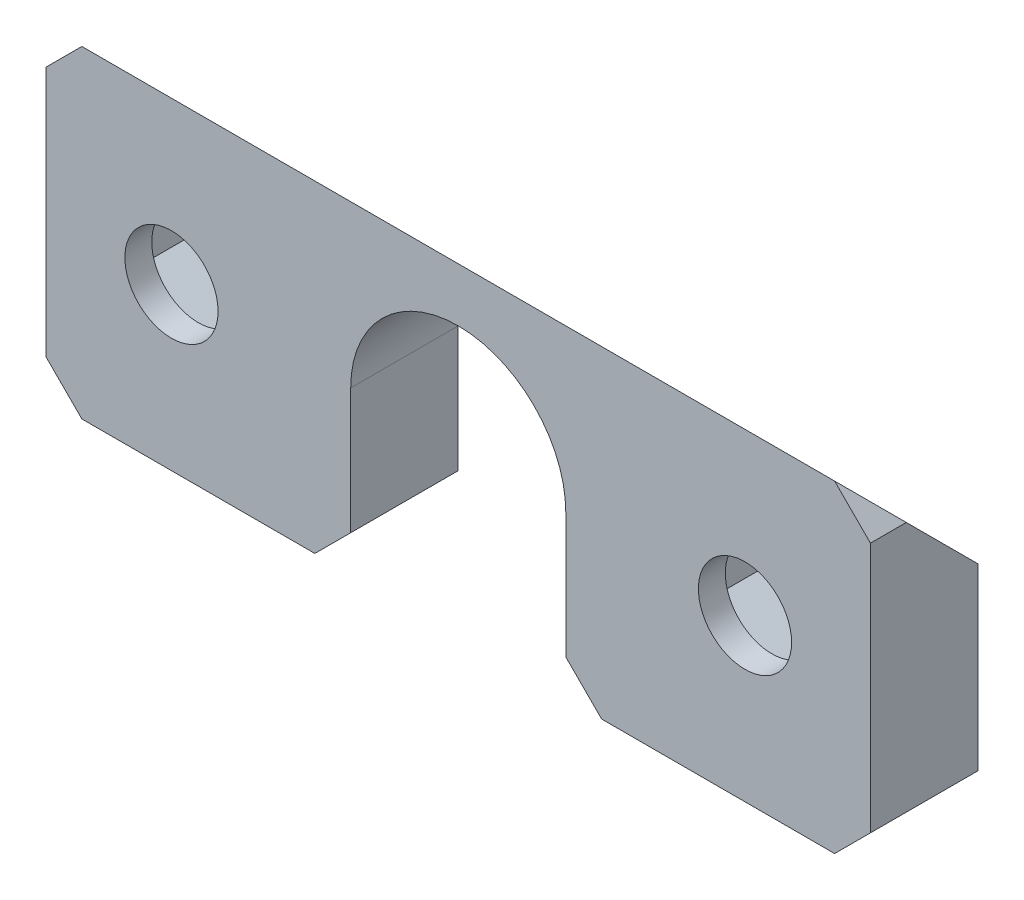
ISO-10303-21;
HEADER;
FILE_DESCRIPTION(('STEP AP214'),'2;1');
FILE_NAME('part.step','',(''),(''),'','','');
FILE_SCHEMA(('AUTOMOTIVE_DESIGN { 1 0 10303 214 1 1 1 1 }'));
ENDSEC;
DATA;
#1=APPLICATION_CONTEXT('core data for automotive mechanical design processes');
#2=APPLICATION_PROTOCOL_DEFINITION('international standard','automotive_design',2000,#1);
#3=PRODUCT_CONTEXT('',#1,'mechanical');
#4=PRODUCT('Part','Part','',(#3));
#5=PRODUCT_RELATED_PRODUCT_CATEGORY('part','',(#4));
#6=PRODUCT_DEFINITION_FORMATION('','',#4);
#7=PRODUCT_DEFINITION_CONTEXT('part definition',#1,'design');
#8=PRODUCT_DEFINITION('design','',#6,#7);
#9=PRODUCT_DEFINITION_SHAPE('','',#8);
#10=(LENGTH_UNIT() NAMED_UNIT(*) SI_UNIT(.MILLI.,.METRE.));
#11=(NAMED_UNIT(*) PLANE_ANGLE_UNIT() SI_UNIT($,.RADIAN.));
#12=(NAMED_UNIT(*) SI_UNIT($,.STERADIAN.) SOLID_ANGLE_UNIT());
#13=UNCERTAINTY_MEASURE_WITH_UNIT(LENGTH_MEASURE(1.E-05),#10,'distance_accuracy_value','');
#14=(GEOMETRIC_REPRESENTATION_CONTEXT(3) GLOBAL_UNCERTAINTY_ASSIGNED_CONTEXT((#13)) GLOBAL_UNIT_ASSIGNED_CONTEXT((#10,
#11,#12)) REPRESENTATION_CONTEXT('',''));
#15=CARTESIAN_POINT('',(0.,0.,0.));
#16=DIRECTION('',(0.,0.,1.));
#17=DIRECTION('',(1.,0.,0.));
#18=AXIS2_PLACEMENT_3D('',#15,#16,#17);
#19=CARTESIAN_POINT('',(-31.2108436137032,-520.298939869288,783.620141884642));
#20=DIRECTION('',(0.,0.,-1.));
#21=DIRECTION('',(-1.,0.,0.));
#22=AXIS2_PLACEMENT_3D('',#19,#20,#21);
#23=PLANE('',#22);
#24=DIRECTION('',(0.,1.,0.));
#25=VECTOR('',#24,1.);
#26=CARTESIAN_POINT('',(-54.2108436137042,-513.298939869288,783.620141884642));
#27=LINE('',#26,#25);
#28=CARTESIAN_POINT('',(-54.2108436137042,-527.298939869288,783.620141884642));
#29=VERTEX_POINT('',#28);
#30=CARTESIAN_POINT('',(-54.2108436137042,-517.298939869288,783.620141884642));
#31=VERTEX_POINT('',#30);
#32=EDGE_CURVE('E317',#29,#31,#27,.T.);
#33=ORIENTED_EDGE('',*,*,#32,.T.);
#34=DIRECTION('',(1.,0.,0.));
#35=VECTOR('',#34,1.);
#36=CARTESIAN_POINT('',(-10.2108436137042,-517.298939869288,783.620141884642));
#37=LINE('',#36,#35);
#38=CARTESIAN_POINT('',(-50.5146911909982,-517.298939869288,783.620141884642));
#39=VERTEX_POINT('',#38);
#40=EDGE_CURVE('E401',#31,#39,#37,.T.);
#41=ORIENTED_EDGE('',*,*,#40,.T.);
#42=DIRECTION('',(0.866025403784443,0.499999999999993,0.));
#43=VECTOR('',#42,1.);
#44=CARTESIAN_POINT('',(-51.4608436137042,-517.845201225232,783.620141884642));
#45=LINE('',#44,#43);
#46=CARTESIAN_POINT('',(-51.4608436137042,-517.845201225232,783.620141884642));
#47=VERTEX_POINT('',#46);
#48=EDGE_CURVE('E495',#47,#39,#45,.T.);
#49=ORIENTED_EDGE('',*,*,#48,.F.);
#50=DIRECTION('',(0.,1.,0.));
#51=VECTOR('',#50,1.);
#52=CARTESIAN_POINT('',(-51.4608436137042,-522.752678513344,783.620141884642));
#53=LINE('',#52,#51);
#54=CARTESIAN_POINT('',(-51.4608436137042,-522.752678513344,783.620141884642));
#55=VERTEX_POINT('',#54);
#56=EDGE_CURVE('E256',#55,#47,#53,.T.);
#57=ORIENTED_EDGE('',*,*,#56,.F.);
#58=DIRECTION('',(-0.866025403784444,0.49999999999999,0.));
#59=VECTOR('',#58,1.);
#60=CARTESIAN_POINT('',(-47.2108436137042,-525.2064171574,783.620141884642));
#61=LINE('',#60,#59);
#62=CARTESIAN_POINT('',(-47.2108436137042,-525.2064171574,783.620141884642));
#63=VERTEX_POINT('',#62);
#64=EDGE_CURVE('E261',#63,#55,#61,.T.);
#65=ORIENTED_EDGE('',*,*,#64,.F.);
#66=DIRECTION('',(-0.866025403784444,-0.499999999999991,0.));
#67=VECTOR('',#66,1.);
#68=CARTESIAN_POINT('',(-42.9608436137042,-522.752678513344,783.620141884642));
#69=LINE('',#68,#67);
#70=CARTESIAN_POINT('',(-42.9608436137042,-522.752678513344,783.620141884642));
#71=VERTEX_POINT('',#70);
#72=EDGE_CURVE('E507',#71,#63,#69,.T.);
#73=ORIENTED_EDGE('',*,*,#72,.F.);
#74=DIRECTION('',(0.,-1.,0.));
#75=VECTOR('',#74,1.);
#76=CARTESIAN_POINT('',(-42.9608436137042,-517.845201225232,783.620141884642));
#77=LINE('',#76,#75);
#78=CARTESIAN_POINT('',(-42.9608436137042,-517.845201225232,783.620141884642));
#79=VERTEX_POINT('',#78);
#80=EDGE_CURVE('E505',#79,#71,#77,.T.);
#81=ORIENTED_EDGE('',*,*,#80,.F.);
#82=DIRECTION('',(0.866025403784436,-0.500000000000005,0.));
#83=VECTOR('',#82,1.);
#84=CARTESIAN_POINT('',(-47.2108436137042,-515.391462581176,783.620141884642));
#85=LINE('',#84,#83);
#86=CARTESIAN_POINT('',(-43.9069960364103,-517.298939869288,783.620141884642));
#87=VERTEX_POINT('',#86);
#88=EDGE_CURVE('E498',#87,#79,#85,.T.);
#89=ORIENTED_EDGE('',*,*,#88,.F.);
#90=DIRECTION('',(1.,0.,0.));
#91=VECTOR('',#90,1.);
#92=CARTESIAN_POINT('',(-10.2108436137042,-517.298939869288,783.620141884642));
#93=LINE('',#92,#91);
#94=CARTESIAN_POINT('',(-36.4069960364099,-517.298939869288,783.620141884642));
#95=VERTEX_POINT('',#94);
#96=EDGE_CURVE('E399',#87,#95,#93,.T.);
#97=ORIENTED_EDGE('',*,*,#96,.T.);
#98=CARTESIAN_POINT('',(-31.2108436137032,-520.298939869288,783.620141884642));
#99=DIRECTION('',(0.,0.,1.));
#100=DIRECTION('',(-1.,0.,0.));
#101=AXIS2_PLACEMENT_3D('',#98,#99,#100);
#102=CIRCLE('',#101,6.);
#103=CARTESIAN_POINT('',(-37.2108436137032,-520.298939869288,783.620141884642));
#104=VERTEX_POINT('',#103);
#105=EDGE_CURVE('E310',#95,#104,#102,.T.);
#106=ORIENTED_EDGE('',*,*,#105,.T.);
#107=DIRECTION('',(0.,-1.,0.));
#108=VECTOR('',#107,1.);
#109=CARTESIAN_POINT('',(-37.2108436137032,-520.298939869288,783.620141884642));
#110=LINE('',#109,#108);
#111=CARTESIAN_POINT('',(-37.2108436137032,-527.298939869288,783.620141884642));
#112=VERTEX_POINT('',#111);
#113=EDGE_CURVE('E309',#104,#112,#110,.T.);
#114=ORIENTED_EDGE('',*,*,#113,.T.);
#115=DIRECTION('',(0.707106781186541,0.707106781186554,0.));
#116=VECTOR('',#115,1.);
#117=CARTESIAN_POINT('',(-30.7108436137034,-520.798939869288,783.620141884642));
#118=LINE('',#117,#116);
#119=CARTESIAN_POINT('',(-39.2108436137032,-529.298939869288,783.620141884642));
#120=VERTEX_POINT('',#119);
#121=EDGE_CURVE('E386',#112,#120,#118,.F.);
#122=ORIENTED_EDGE('',*,*,#121,.T.);
#123=DIRECTION('',(-1.,0.,0.));
#124=VECTOR('',#123,1.);
#125=CARTESIAN_POINT('',(-37.2108436137032,-529.298939869288,783.620141884642));
#126=LINE('',#125,#124);
#127=CARTESIAN_POINT('',(-52.2108436137042,-529.298939869288,783.620141884642));
#128=VERTEX_POINT('',#127);
#129=EDGE_CURVE('E313',#120,#128,#126,.T.);
#130=ORIENTED_EDGE('',*,*,#129,.T.);
#131=DIRECTION('',(-0.707106781186547,0.707106781186547,0.));
#132=VECTOR('',#131,1.);
#133=CARTESIAN_POINT('',(-52.2108436137042,-529.298939869288,783.620141884642));
#134=LINE('',#133,#132);
#135=EDGE_CURVE('E315',#128,#29,#134,.T.);
#136=ORIENTED_EDGE('',*,*,#135,.T.);
#137=EDGE_LOOP('',(#33,#41,#49,#57,#65,#73,#81,#89,#97,#106,#114,#122,#130,#136));
#138=FACE_BOUND('',#137,.T.);
#139=ADVANCED_FACE('F38',(#138),#23,.T.);
#140=CARTESIAN_POINT('',(-15.2108436137042,-515.391462581176,783.620141884642));
#141=DIRECTION('',(-0.500000000000013,-0.866025403784431,0.));
#142=DIRECTION('',(0.866025403784431,-0.500000000000013,0.));
#143=AXIS2_PLACEMENT_3D('',#140,#141,#142);
#144=PLANE('',#143);
#145=DIRECTION('',(0.,0.,1.));
#146=VECTOR('',#145,1.);
#147=CARTESIAN_POINT('',(-15.2108436137042,-515.391462581176,783.620141884642));
#148=LINE('',#147,#146);
#149=CARTESIAN_POINT('',(-15.2108436137042,-515.391462581176,785.527619172755));
#150=VERTEX_POINT('',#149);
#151=CARTESIAN_POINT('',(-15.2108436137042,-515.391462581176,788.120141884643));
#152=VERTEX_POINT('',#151);
#153=EDGE_CURVE('E288',#150,#152,#148,.T.);
#154=ORIENTED_EDGE('',*,*,#153,.F.);
#155=DIRECTION('',(0.774596669241475,-0.447213595499969,-0.447213595499961));
#156=VECTOR('',#155,1.);
#157=CARTESIAN_POINT('',(-14.5500740982454,-515.772958038799,785.146123715132));
#158=LINE('',#157,#156);
#159=CARTESIAN_POINT('',(-11.9069960364104,-517.298939869288,783.620141884642));
#160=VERTEX_POINT('',#159);
#161=EDGE_CURVE('E412',#150,#160,#158,.T.);
#162=ORIENTED_EDGE('',*,*,#161,.T.);
#163=DIRECTION('',(0.866025403784431,-0.500000000000013,0.));
#164=VECTOR('',#163,1.);
#165=CARTESIAN_POINT('',(-15.2108436137042,-515.391462581176,783.620141884642));
#166=LINE('',#165,#164);
#167=CARTESIAN_POINT('',(-10.9608436137042,-517.845201225232,783.620141884642));
#168=VERTEX_POINT('',#167);
#169=EDGE_CURVE('E274',#160,#168,#166,.T.);
#170=ORIENTED_EDGE('',*,*,#169,.T.);
#171=DIRECTION('',(0.,0.,1.));
#172=VECTOR('',#171,1.);
#173=CARTESIAN_POINT('',(-10.9608436137042,-517.845201225232,783.620141884642));
#174=LINE('',#173,#172);
#175=CARTESIAN_POINT('',(-10.9608436137042,-517.845201225232,788.120141884643));
#176=VERTEX_POINT('',#175);
#177=EDGE_CURVE('E302',#168,#176,#174,.T.);
#178=ORIENTED_EDGE('',*,*,#177,.T.);
#179=DIRECTION('',(-0.866025403784431,0.500000000000013,0.));
#180=VECTOR('',#179,1.);
#181=CARTESIAN_POINT('',(-15.2108436137042,-515.391462581176,788.120141884643));
#182=LINE('',#181,#180);
#183=EDGE_CURVE('E491',#176,#152,#182,.T.);
#184=ORIENTED_EDGE('',*,*,#183,.T.);
#185=EDGE_LOOP('',(#154,#162,#170,#178,#184));
#186=FACE_BOUND('',#185,.T.);
#187=ADVANCED_FACE('F454',(#186),#144,.T.);
#188=CARTESIAN_POINT('',(-10.9608436137042,-517.845201225232,783.620141884642));
#189=DIRECTION('',(-1.,0.,0.));
#190=DIRECTION('',(0.,0.,1.));
#191=AXIS2_PLACEMENT_3D('',#188,#189,#190);
#192=PLANE('',#191);
#193=DIRECTION('',(0.,0.,1.));
#194=VECTOR('',#193,1.);
#195=CARTESIAN_POINT('',(-10.9608436137042,-522.752678513344,783.620141884642));
#196=LINE('',#195,#194);
#197=CARTESIAN_POINT('',(-10.9608436137042,-522.752678513344,783.620141884642));
#198=VERTEX_POINT('',#197);
#199=CARTESIAN_POINT('',(-10.9608436137042,-522.752678513344,788.120141884643));
#200=VERTEX_POINT('',#199);
#201=EDGE_CURVE('E299',#198,#200,#196,.T.);
#202=ORIENTED_EDGE('',*,*,#201,.T.);
#203=DIRECTION('',(0.,1.,0.));
#204=VECTOR('',#203,1.);
#205=CARTESIAN_POINT('',(-10.9608436137042,-517.845201225232,788.120141884643));
#206=LINE('',#205,#204);
#207=EDGE_CURVE('E496',#200,#176,#206,.T.);
#208=ORIENTED_EDGE('',*,*,#207,.T.);
#209=ORIENTED_EDGE('',*,*,#177,.F.);
#210=DIRECTION('',(0.,-1.,0.));
#211=VECTOR('',#210,1.);
#212=CARTESIAN_POINT('',(-10.9608436137042,-517.845201225232,783.620141884642));
#213=LINE('',#212,#211);
#214=EDGE_CURVE('E276',#168,#198,#213,.T.);
#215=ORIENTED_EDGE('',*,*,#214,.T.);
#216=EDGE_LOOP('',(#202,#208,#209,#215));
#217=FACE_BOUND('',#216,.T.);
#218=ADVANCED_FACE('F460',(#217),#192,.T.);
#219=CARTESIAN_POINT('',(-10.9608436137042,-522.752678513344,783.620141884642));
#220=DIRECTION('',(-0.500000000000002,0.866025403784438,0.));
#221=DIRECTION('',(-0.866025403784438,-0.500000000000002,0.));
#222=AXIS2_PLACEMENT_3D('',#219,#220,#221);
#223=PLANE('',#222);
#224=DIRECTION('',(0.,0.,1.));
#225=VECTOR('',#224,1.);
#226=CARTESIAN_POINT('',(-15.2108436137043,-525.2064171574,783.620141884642));
#227=LINE('',#226,#225);
#228=CARTESIAN_POINT('',(-15.2108436137043,-525.2064171574,783.620141884642));
#229=VERTEX_POINT('',#228);
#230=CARTESIAN_POINT('',(-15.2108436137043,-525.2064171574,788.120141884643));
#231=VERTEX_POINT('',#230);
#232=EDGE_CURVE('E296',#229,#231,#227,.T.);
#233=ORIENTED_EDGE('',*,*,#232,.T.);
#234=DIRECTION('',(0.866025403784438,0.500000000000002,0.));
#235=VECTOR('',#234,1.);
#236=CARTESIAN_POINT('',(-10.9608436137042,-522.752678513344,788.120141884643));
#237=LINE('',#236,#235);
#238=EDGE_CURVE('E500',#231,#200,#237,.T.);
#239=ORIENTED_EDGE('',*,*,#238,.T.);
#240=ORIENTED_EDGE('',*,*,#201,.F.);
#241=DIRECTION('',(-0.866025403784438,-0.500000000000002,0.));
#242=VECTOR('',#241,1.);
#243=CARTESIAN_POINT('',(-10.9608436137042,-522.752678513344,783.620141884642));
#244=LINE('',#243,#242);
#245=EDGE_CURVE('E278',#198,#229,#244,.T.);
#246=ORIENTED_EDGE('',*,*,#245,.T.);
#247=EDGE_LOOP('',(#233,#239,#240,#246));
#248=FACE_BOUND('',#247,.T.);
#249=ADVANCED_FACE('F788',(#248),#223,.T.);
#250=CARTESIAN_POINT('',(-15.2108436137043,-525.2064171574,783.620141884642));
#251=DIRECTION('',(0.500000000000013,0.866025403784431,0.));
#252=DIRECTION('',(-0.866025403784431,0.500000000000013,0.));
#253=AXIS2_PLACEMENT_3D('',#250,#251,#252);
#254=PLANE('',#253);
#255=DIRECTION('',(0.,0.,1.));
#256=VECTOR('',#255,1.);
#257=CARTESIAN_POINT('',(-19.4608436137042,-522.752678513344,783.620141884642));
#258=LINE('',#257,#256);
#259=CARTESIAN_POINT('',(-19.4608436137042,-522.752678513344,783.620141884642));
#260=VERTEX_POINT('',#259);
#261=CARTESIAN_POINT('',(-19.4608436137042,-522.752678513344,788.120141884643));
#262=VERTEX_POINT('',#261);
#263=EDGE_CURVE('E293',#260,#262,#258,.T.);
#264=ORIENTED_EDGE('',*,*,#263,.T.);
#265=DIRECTION('',(0.866025403784431,-0.500000000000013,0.));
#266=VECTOR('',#265,1.);
#267=CARTESIAN_POINT('',(-15.2108436137043,-525.2064171574,788.120141884643));
#268=LINE('',#267,#266);
#269=EDGE_CURVE('E820',#262,#231,#268,.T.);
#270=ORIENTED_EDGE('',*,*,#269,.T.);
#271=ORIENTED_EDGE('',*,*,#232,.F.);
#272=DIRECTION('',(-0.866025403784431,0.500000000000013,0.));
#273=VECTOR('',#272,1.);
#274=CARTESIAN_POINT('',(-15.2108436137043,-525.2064171574,783.620141884642));
#275=LINE('',#274,#273);
#276=EDGE_CURVE('E280',#229,#260,#275,.T.);
#277=ORIENTED_EDGE('',*,*,#276,.T.);
#278=EDGE_LOOP('',(#264,#270,#271,#277));
#279=FACE_BOUND('',#278,.T.);
#280=ADVANCED_FACE('F778',(#279),#254,.T.);
#281=CARTESIAN_POINT('',(-19.4608436137042,-522.752678513344,783.620141884642));
#282=DIRECTION('',(1.,0.,0.));
#283=DIRECTION('',(0.,1.,0.));
#284=AXIS2_PLACEMENT_3D('',#281,#282,#283);
#285=PLANE('',#284);
#286=DIRECTION('',(0.,0.,1.));
#287=VECTOR('',#286,1.);
#288=CARTESIAN_POINT('',(-19.4608436137042,-517.845201225232,783.620141884642));
#289=LINE('',#288,#287);
#290=CARTESIAN_POINT('',(-19.4608436137042,-517.845201225232,783.620141884642));
#291=VERTEX_POINT('',#290);
#292=CARTESIAN_POINT('',(-19.4608436137042,-517.845201225232,788.120141884643));
#293=VERTEX_POINT('',#292);
#294=EDGE_CURVE('E290',#291,#293,#289,.T.);
#295=ORIENTED_EDGE('',*,*,#294,.T.);
#296=DIRECTION('',(0.,-1.,0.));
#297=VECTOR('',#296,1.);
#298=CARTESIAN_POINT('',(-19.4608436137042,-522.752678513344,788.120141884643));
#299=LINE('',#298,#297);
#300=EDGE_CURVE('E819',#293,#262,#299,.T.);
#301=ORIENTED_EDGE('',*,*,#300,.T.);
#302=ORIENTED_EDGE('',*,*,#263,.F.);
#303=DIRECTION('',(0.,1.,0.));
#304=VECTOR('',#303,1.);
#305=CARTESIAN_POINT('',(-19.4608436137042,-522.752678513344,783.620141884642));
#306=LINE('',#305,#304);
#307=EDGE_CURVE('E282',#260,#291,#306,.T.);
#308=ORIENTED_EDGE('',*,*,#307,.T.);
#309=EDGE_LOOP('',(#295,#301,#302,#308));
#310=FACE_BOUND('',#309,.T.);
#311=ADVANCED_FACE('F637',(#310),#285,.T.);
#312=CARTESIAN_POINT('',(-19.4608436137042,-517.845201225232,783.620141884642));
#313=DIRECTION('',(0.500000000000002,-0.866025403784438,0.));
#314=DIRECTION('',(0.866025403784438,0.500000000000002,0.));
#315=AXIS2_PLACEMENT_3D('',#312,#313,#314);
#316=PLANE('',#315);
#317=DIRECTION('',(0.866025403784438,0.500000000000002,0.));
#318=VECTOR('',#317,1.);
#319=CARTESIAN_POINT('',(-19.4608436137042,-517.845201225232,783.620141884642));
#320=LINE('',#319,#318);
#321=CARTESIAN_POINT('',(-18.5146911909981,-517.298939869288,783.620141884642));
#322=VERTEX_POINT('',#321);
#323=EDGE_CURVE('E285',#291,#322,#320,.T.);
#324=ORIENTED_EDGE('',*,*,#323,.T.);
#325=DIRECTION('',(0.774596669241485,0.447213595499961,0.447213595499953));
#326=VECTOR('',#325,1.);
#327=CARTESIAN_POINT('',(-19.271613129163,-517.735948954043,783.183132799887));
#328=LINE('',#327,#326);
#329=EDGE_CURVE('E410',#322,#150,#328,.T.);
#330=ORIENTED_EDGE('',*,*,#329,.T.);
#331=ORIENTED_EDGE('',*,*,#153,.T.);
#332=DIRECTION('',(-0.866025403784438,-0.500000000000002,0.));
#333=VECTOR('',#332,1.);
#334=CARTESIAN_POINT('',(-19.4608436137042,-517.845201225232,788.120141884643));
#335=LINE('',#334,#333);
#336=EDGE_CURVE('E251',#152,#293,#335,.T.);
#337=ORIENTED_EDGE('',*,*,#336,.T.);
#338=ORIENTED_EDGE('',*,*,#294,.F.);
#339=EDGE_LOOP('',(#324,#330,#331,#337,#338));
#340=FACE_BOUND('',#339,.T.);
#341=ADVANCED_FACE('F486',(#340),#316,.T.);
#342=CARTESIAN_POINT('',(-51.4608436137042,-517.845201225232,783.620141884642));
#343=DIRECTION('',(0.499999999999993,-0.866025403784443,0.));
#344=DIRECTION('',(0.866025403784443,0.499999999999993,0.));
#345=AXIS2_PLACEMENT_3D('',#342,#343,#344);
#346=PLANE('',#345);
#347=ORIENTED_EDGE('',*,*,#48,.T.);
#348=DIRECTION('',(0.774596669241492,0.447213595499954,0.447213595499946));
#349=VECTOR('',#348,1.);
#350=CARTESIAN_POINT('',(-51.271613129163,-517.735948954043,783.183132799888));
#351=LINE('',#350,#349);
#352=CARTESIAN_POINT('',(-47.2108436137042,-515.391462581176,785.527619172755));
#353=VERTEX_POINT('',#352);
#354=EDGE_CURVE('E404',#39,#353,#351,.T.);
#355=ORIENTED_EDGE('',*,*,#354,.T.);
#356=DIRECTION('',(0.,0.,1.));
#357=VECTOR('',#356,1.);
#358=CARTESIAN_POINT('',(-47.2108436137042,-515.391462581176,783.620141884642));
#359=LINE('',#358,#357);
#360=CARTESIAN_POINT('',(-47.2108436137042,-515.391462581176,788.120141884643));
#361=VERTEX_POINT('',#360);
#362=EDGE_CURVE('E250',#353,#361,#359,.T.);
#363=ORIENTED_EDGE('',*,*,#362,.T.);
#364=DIRECTION('',(-0.866025403784443,-0.499999999999993,0.));
#365=VECTOR('',#364,1.);
#366=CARTESIAN_POINT('',(-51.4608436137042,-517.845201225232,788.120141884643));
#367=LINE('',#366,#365);
#368=CARTESIAN_POINT('',(-51.4608436137042,-517.845201225232,788.120141884643));
#369=VERTEX_POINT('',#368);
#370=EDGE_CURVE('E233',#361,#369,#367,.T.);
#371=ORIENTED_EDGE('',*,*,#370,.T.);
#372=DIRECTION('',(0.,0.,1.));
#373=VECTOR('',#372,1.);
#374=CARTESIAN_POINT('',(-51.4608436137042,-517.845201225232,783.620141884642));
#375=LINE('',#374,#373);
#376=EDGE_CURVE('E247',#47,#369,#375,.T.);
#377=ORIENTED_EDGE('',*,*,#376,.F.);
#378=EDGE_LOOP('',(#347,#355,#363,#371,#377));
#379=FACE_BOUND('',#378,.T.);
#380=ADVANCED_FACE('F246',(#379),#346,.T.);
#381=CARTESIAN_POINT('',(-47.2108436137042,-515.391462581176,783.620141884642));
#382=DIRECTION('',(-0.500000000000005,-0.866025403784435,0.));
#383=DIRECTION('',(0.866025403784436,-0.500000000000005,0.));
#384=AXIS2_PLACEMENT_3D('',#381,#382,#383);
#385=PLANE('',#384);
#386=ORIENTED_EDGE('',*,*,#362,.F.);
#387=DIRECTION('',(0.774596669241482,-0.447213595499963,-0.447213595499955));
#388=VECTOR('',#387,1.);
#389=CARTESIAN_POINT('',(-46.5500740982454,-515.772958038799,785.146123715132));
#390=LINE('',#389,#388);
#391=EDGE_CURVE('E406',#353,#87,#390,.T.);
#392=ORIENTED_EDGE('',*,*,#391,.T.);
#393=ORIENTED_EDGE('',*,*,#88,.T.);
#394=DIRECTION('',(0.,0.,1.));
#395=VECTOR('',#394,1.);
#396=CARTESIAN_POINT('',(-42.9608436137042,-517.845201225232,783.620141884642));
#397=LINE('',#396,#395);
#398=CARTESIAN_POINT('',(-42.9608436137042,-517.845201225232,788.120141884643));
#399=VERTEX_POINT('',#398);
#400=EDGE_CURVE('E270',#79,#399,#397,.T.);
#401=ORIENTED_EDGE('',*,*,#400,.T.);
#402=DIRECTION('',(-0.866025403784436,0.500000000000005,0.));
#403=VECTOR('',#402,1.);
#404=CARTESIAN_POINT('',(-47.2108436137042,-515.391462581176,788.120141884643));
#405=LINE('',#404,#403);
#406=EDGE_CURVE('E252',#399,#361,#405,.T.);
#407=ORIENTED_EDGE('',*,*,#406,.T.);
#408=EDGE_LOOP('',(#386,#392,#393,#401,#407));
#409=FACE_BOUND('',#408,.T.);
#410=ADVANCED_FACE('F515',(#409),#385,.T.);
#411=CARTESIAN_POINT('',(-42.9608436137042,-517.845201225232,783.620141884642));
#412=DIRECTION('',(-1.,0.,0.));
#413=DIRECTION('',(0.,0.,1.));
#414=AXIS2_PLACEMENT_3D('',#411,#412,#413);
#415=PLANE('',#414);
#416=DIRECTION('',(0.,0.,1.));
#417=VECTOR('',#416,1.);
#418=CARTESIAN_POINT('',(-42.9608436137042,-522.752678513344,783.620141884642));
#419=LINE('',#418,#417);
#420=CARTESIAN_POINT('',(-42.9608436137042,-522.752678513344,788.120141884643));
#421=VERTEX_POINT('',#420);
#422=EDGE_CURVE('E267',#71,#421,#419,.T.);
#423=ORIENTED_EDGE('',*,*,#422,.T.);
#424=DIRECTION('',(0.,1.,0.));
#425=VECTOR('',#424,1.);
#426=CARTESIAN_POINT('',(-42.9608436137042,-517.845201225232,788.120141884643));
#427=LINE('',#426,#425);
#428=EDGE_CURVE('E826',#421,#399,#427,.T.);
#429=ORIENTED_EDGE('',*,*,#428,.T.);
#430=ORIENTED_EDGE('',*,*,#400,.F.);
#431=ORIENTED_EDGE('',*,*,#80,.T.);
#432=EDGE_LOOP('',(#423,#429,#430,#431));
#433=FACE_BOUND('',#432,.T.);
#434=ADVANCED_FACE('F618',(#433),#415,.T.);
#435=CARTESIAN_POINT('',(-42.9608436137042,-522.752678513344,783.620141884642));
#436=DIRECTION('',(-0.499999999999991,0.866025403784444,0.));
#437=DIRECTION('',(-0.866025403784444,-0.499999999999991,0.));
#438=AXIS2_PLACEMENT_3D('',#435,#436,#437);
#439=PLANE('',#438);
#440=DIRECTION('',(0.,0.,1.));
#441=VECTOR('',#440,1.);
#442=CARTESIAN_POINT('',(-47.2108436137042,-525.2064171574,783.620141884642));
#443=LINE('',#442,#441);
#444=CARTESIAN_POINT('',(-47.2108436137042,-525.2064171574,788.120141884643));
#445=VERTEX_POINT('',#444);
#446=EDGE_CURVE('E259',#63,#445,#443,.T.);
#447=ORIENTED_EDGE('',*,*,#446,.T.);
#448=DIRECTION('',(0.866025403784444,0.499999999999991,0.));
#449=VECTOR('',#448,1.);
#450=CARTESIAN_POINT('',(-42.9608436137042,-522.752678513344,788.120141884643));
#451=LINE('',#450,#449);
#452=EDGE_CURVE('E829',#445,#421,#451,.T.);
#453=ORIENTED_EDGE('',*,*,#452,.T.);
#454=ORIENTED_EDGE('',*,*,#422,.F.);
#455=ORIENTED_EDGE('',*,*,#72,.T.);
#456=EDGE_LOOP('',(#447,#453,#454,#455));
#457=FACE_BOUND('',#456,.T.);
#458=ADVANCED_FACE('F755',(#457),#439,.T.);
#459=CARTESIAN_POINT('',(-47.2108436137042,-525.2064171574,783.620141884642));
#460=DIRECTION('',(0.49999999999999,0.866025403784444,0.));
#461=DIRECTION('',(-0.866025403784444,0.49999999999999,0.));
#462=AXIS2_PLACEMENT_3D('',#459,#460,#461);
#463=PLANE('',#462);
#464=DIRECTION('',(0.,0.,1.));
#465=VECTOR('',#464,1.);
#466=CARTESIAN_POINT('',(-51.4608436137042,-522.752678513344,783.620141884642));
#467=LINE('',#466,#465);
#468=CARTESIAN_POINT('',(-51.4608436137042,-522.752678513344,788.120141884643));
#469=VERTEX_POINT('',#468);
#470=EDGE_CURVE('E257',#55,#469,#467,.T.);
#471=ORIENTED_EDGE('',*,*,#470,.T.);
#472=DIRECTION('',(0.866025403784444,-0.49999999999999,0.));
#473=VECTOR('',#472,1.);
#474=CARTESIAN_POINT('',(-47.2108436137042,-525.2064171574,788.120141884643));
#475=LINE('',#474,#473);
#476=EDGE_CURVE('E236',#469,#445,#475,.T.);
#477=ORIENTED_EDGE('',*,*,#476,.T.);
#478=ORIENTED_EDGE('',*,*,#446,.F.);
#479=ORIENTED_EDGE('',*,*,#64,.T.);
#480=EDGE_LOOP('',(#471,#477,#478,#479));
#481=FACE_BOUND('',#480,.T.);
#482=ADVANCED_FACE('F471',(#481),#463,.T.);
#483=CARTESIAN_POINT('',(-51.4608436137042,-522.752678513344,783.620141884642));
#484=DIRECTION('',(1.,0.,0.));
#485=DIRECTION('',(0.,0.,-1.));
#486=AXIS2_PLACEMENT_3D('',#483,#484,#485);
#487=PLANE('',#486);
#488=ORIENTED_EDGE('',*,*,#376,.T.);
#489=DIRECTION('',(0.,-1.,0.));
#490=VECTOR('',#489,1.);
#491=CARTESIAN_POINT('',(-51.4608436137042,-522.752678513344,788.120141884643));
#492=LINE('',#491,#490);
#493=EDGE_CURVE('E229',#369,#469,#492,.T.);
#494=ORIENTED_EDGE('',*,*,#493,.T.);
#495=ORIENTED_EDGE('',*,*,#470,.F.);
#496=ORIENTED_EDGE('',*,*,#56,.T.);
#497=EDGE_LOOP('',(#488,#494,#495,#496));
#498=FACE_BOUND('',#497,.T.);
#499=ADVANCED_FACE('F254',(#498),#487,.T.);
#500=CARTESIAN_POINT('',(-25.2108436137032,-520.298939869288,783.620141884642));
#501=VERTEX_POINT('',#500);
#502=CARTESIAN_POINT('',(-26.0146911909966,-517.298939869288,783.620141884642));
#503=VERTEX_POINT('',#502);
#504=EDGE_CURVE('E306',#501,#503,#102,.T.);
#505=ORIENTED_EDGE('',*,*,#504,.T.);
#506=DIRECTION('',(1.,0.,0.));
#507=VECTOR('',#506,1.);
#508=CARTESIAN_POINT('',(-10.2108436137042,-517.298939869288,783.620141884642));
#509=LINE('',#508,#507);
#510=EDGE_CURVE('E397',#503,#322,#509,.T.);
#511=ORIENTED_EDGE('',*,*,#510,.T.);
#512=ORIENTED_EDGE('',*,*,#323,.F.);
#513=ORIENTED_EDGE('',*,*,#307,.F.);
#514=ORIENTED_EDGE('',*,*,#276,.F.);
#515=ORIENTED_EDGE('',*,*,#245,.F.);
#516=ORIENTED_EDGE('',*,*,#214,.F.);
#517=ORIENTED_EDGE('',*,*,#169,.F.);
#518=DIRECTION('',(1.,0.,0.));
#519=VECTOR('',#518,1.);
#520=CARTESIAN_POINT('',(-10.2108436137042,-517.298939869288,783.620141884642));
#521=LINE('',#520,#519);
#522=CARTESIAN_POINT('',(-8.21084361370418,-517.298939869288,783.620141884642));
#523=VERTEX_POINT('',#522);
#524=EDGE_CURVE('E395',#160,#523,#521,.T.);
#525=ORIENTED_EDGE('',*,*,#524,.T.);
#526=DIRECTION('',(0.,-1.,0.));
#527=VECTOR('',#526,1.);
#528=CARTESIAN_POINT('',(-8.21084361370418,-513.298939869288,783.620141884642));
#529=LINE('',#528,#527);
#530=CARTESIAN_POINT('',(-8.21084361370418,-527.298939869288,783.620141884642));
#531=VERTEX_POINT('',#530);
#532=EDGE_CURVE('E320',#523,#531,#529,.T.);
#533=ORIENTED_EDGE('',*,*,#532,.T.);
#534=DIRECTION('',(-0.707106781186547,-0.707106781186548,0.));
#535=VECTOR('',#534,1.);
#536=CARTESIAN_POINT('',(-8.21084361370418,-527.298939869288,783.620141884642));
#537=LINE('',#536,#535);
#538=CARTESIAN_POINT('',(-10.2108436137042,-529.298939869288,783.620141884642));
#539=VERTEX_POINT('',#538);
#540=EDGE_CURVE('E322',#531,#539,#537,.T.);
#541=ORIENTED_EDGE('',*,*,#540,.T.);
#542=DIRECTION('',(-1.,0.,0.));
#543=VECTOR('',#542,1.);
#544=CARTESIAN_POINT('',(-10.2108436137042,-529.298939869288,783.620141884642));
#545=LINE('',#544,#543);
#546=CARTESIAN_POINT('',(-23.2108436137032,-529.298939869288,783.620141884642));
#547=VERTEX_POINT('',#546);
#548=EDGE_CURVE('E324',#539,#547,#545,.T.);
#549=ORIENTED_EDGE('',*,*,#548,.T.);
#550=DIRECTION('',(0.707106781186554,-0.707106781186541,0.));
#551=VECTOR('',#550,1.);
#552=CARTESIAN_POINT('',(-31.7108436137032,-520.798939869288,783.620141884642));
#553=LINE('',#552,#551);
#554=CARTESIAN_POINT('',(-25.2108436137032,-527.298939869288,783.620141884642));
#555=VERTEX_POINT('',#554);
#556=EDGE_CURVE('E388',#547,#555,#553,.F.);
#557=ORIENTED_EDGE('',*,*,#556,.T.);
#558=DIRECTION('',(0.,1.,0.));
#559=VECTOR('',#558,1.);
#560=CARTESIAN_POINT('',(-25.2108436137032,-520.298939869288,783.620141884642));
#561=LINE('',#560,#559);
#562=EDGE_CURVE('E327',#555,#501,#561,.T.);
#563=ORIENTED_EDGE('',*,*,#562,.T.);
#564=EDGE_LOOP('',(#505,#511,#512,#513,#514,#515,#516,#517,#525,#533,#541,#549,#557,#563));
#565=FACE_BOUND('',#564,.T.);
#566=ADVANCED_FACE('F456',(#565),#23,.T.);
#567=CARTESIAN_POINT('',(-31.2108436137032,-520.298939869288,789.620141884643));
#568=DIRECTION('',(0.,0.,-1.));
#569=DIRECTION('',(-1.,0.,0.));
#570=AXIS2_PLACEMENT_3D('',#567,#568,#569);
#571=PLANE('',#570);
#572=DIRECTION('',(0.,1.,0.));
#573=VECTOR('',#572,1.);
#574=CARTESIAN_POINT('',(-25.2108436137032,-520.298939869288,789.620141884643));
#575=LINE('',#574,#573);
#576=CARTESIAN_POINT('',(-25.2108436137032,-527.298939869288,789.620141884643));
#577=VERTEX_POINT('',#576);
#578=CARTESIAN_POINT('',(-25.2108436137032,-520.298939869288,789.620141884643));
#579=VERTEX_POINT('',#578);
#580=EDGE_CURVE('E360',#577,#579,#575,.T.);
#581=ORIENTED_EDGE('',*,*,#580,.F.);
#582=DIRECTION('',(-0.707106781186554,0.707106781186541,0.));
#583=VECTOR('',#582,1.);
#584=CARTESIAN_POINT('',(-25.2108436137032,-527.298939869288,789.620141884643));
#585=LINE('',#584,#583);
#586=CARTESIAN_POINT('',(-23.2108436137032,-529.298939869288,789.620141884643));
#587=VERTEX_POINT('',#586);
#588=EDGE_CURVE('E382',#577,#587,#585,.F.);
#589=ORIENTED_EDGE('',*,*,#588,.T.);
#590=DIRECTION('',(-1.,0.,0.));
#591=VECTOR('',#590,1.);
#592=CARTESIAN_POINT('',(-10.2108436137042,-529.298939869288,789.620141884643));
#593=LINE('',#592,#591);
#594=CARTESIAN_POINT('',(-10.2108436137042,-529.298939869288,789.620141884643));
#595=VERTEX_POINT('',#594);
#596=EDGE_CURVE('E357',#595,#587,#593,.T.);
#597=ORIENTED_EDGE('',*,*,#596,.F.);
#598=DIRECTION('',(-0.707106781186547,-0.707106781186548,0.));
#599=VECTOR('',#598,1.);
#600=CARTESIAN_POINT('',(-8.21084361370418,-527.298939869288,789.620141884643));
#601=LINE('',#600,#599);
#602=CARTESIAN_POINT('',(-8.21084361370418,-527.298939869288,789.620141884643));
#603=VERTEX_POINT('',#602);
#604=EDGE_CURVE('E354',#603,#595,#601,.T.);
#605=ORIENTED_EDGE('',*,*,#604,.F.);
#606=DIRECTION('',(0.,-1.,0.));
#607=VECTOR('',#606,1.);
#608=CARTESIAN_POINT('',(-8.21084361370418,-513.298939869288,789.620141884643));
#609=LINE('',#608,#607);
#610=CARTESIAN_POINT('',(-8.21084361370418,-513.298939869288,789.620141884643));
#611=VERTEX_POINT('',#610);
#612=EDGE_CURVE('E351',#611,#603,#609,.T.);
#613=ORIENTED_EDGE('',*,*,#612,.F.);
#614=DIRECTION('',(0.707106781186547,-0.707106781186548,0.));
#615=VECTOR('',#614,1.);
#616=CARTESIAN_POINT('',(-8.21084361370418,-513.298939869288,789.620141884643));
#617=LINE('',#616,#615);
#618=CARTESIAN_POINT('',(-10.2108436137042,-511.298939869288,789.620141884643));
#619=VERTEX_POINT('',#618);
#620=EDGE_CURVE('E348',#619,#611,#617,.T.);
#621=ORIENTED_EDGE('',*,*,#620,.F.);
#622=DIRECTION('',(1.,0.,0.));
#623=VECTOR('',#622,1.);
#624=CARTESIAN_POINT('',(-10.2108436137042,-511.298939869288,789.620141884643));
#625=LINE('',#624,#623);
#626=CARTESIAN_POINT('',(-52.2108436137042,-511.298939869288,789.620141884643));
#627=VERTEX_POINT('',#626);
#628=EDGE_CURVE('E345',#627,#619,#625,.T.);
#629=ORIENTED_EDGE('',*,*,#628,.F.);
#630=DIRECTION('',(0.707106781186547,0.707106781186547,0.));
#631=VECTOR('',#630,1.);
#632=CARTESIAN_POINT('',(-52.2108436137042,-511.298939869288,789.620141884643));
#633=LINE('',#632,#631);
#634=CARTESIAN_POINT('',(-54.2108436137042,-513.298939869288,789.620141884643));
#635=VERTEX_POINT('',#634);
#636=EDGE_CURVE('E343',#635,#627,#633,.T.);
#637=ORIENTED_EDGE('',*,*,#636,.F.);
#638=DIRECTION('',(0.,1.,0.));
#639=VECTOR('',#638,1.);
#640=CARTESIAN_POINT('',(-54.2108436137042,-513.298939869288,789.620141884643));
#641=LINE('',#640,#639);
#642=CARTESIAN_POINT('',(-54.2108436137042,-527.298939869288,789.620141884643));
#643=VERTEX_POINT('',#642);
#644=EDGE_CURVE('E340',#643,#635,#641,.T.);
#645=ORIENTED_EDGE('',*,*,#644,.F.);
#646=DIRECTION('',(-0.707106781186547,0.707106781186547,0.));
#647=VECTOR('',#646,1.);
#648=CARTESIAN_POINT('',(-52.2108436137042,-529.298939869288,789.620141884643));
#649=LINE('',#648,#647);
#650=CARTESIAN_POINT('',(-52.2108436137042,-529.298939869288,789.620141884643));
#651=VERTEX_POINT('',#650);
#652=EDGE_CURVE('E337',#651,#643,#649,.T.);
#653=ORIENTED_EDGE('',*,*,#652,.F.);
#654=DIRECTION('',(-1.,0.,0.));
#655=VECTOR('',#654,1.);
#656=CARTESIAN_POINT('',(-37.2108436137032,-529.298939869288,789.620141884643));
#657=LINE('',#656,#655);
#658=CARTESIAN_POINT('',(-39.2108436137032,-529.298939869288,789.620141884643));
#659=VERTEX_POINT('',#658);
#660=EDGE_CURVE('E335',#659,#651,#657,.T.);
#661=ORIENTED_EDGE('',*,*,#660,.F.);
#662=DIRECTION('',(-0.707106781186541,-0.707106781186554,0.));
#663=VECTOR('',#662,1.);
#664=CARTESIAN_POINT('',(-39.2108436137032,-529.298939869288,789.620141884643));
#665=LINE('',#664,#663);
#666=CARTESIAN_POINT('',(-37.2108436137032,-527.298939869288,789.620141884643));
#667=VERTEX_POINT('',#666);
#668=EDGE_CURVE('E380',#659,#667,#665,.F.);
#669=ORIENTED_EDGE('',*,*,#668,.T.);
#670=DIRECTION('',(0.,-1.,0.));
#671=VECTOR('',#670,1.);
#672=CARTESIAN_POINT('',(-37.2108436137032,-520.298939869288,789.620141884643));
#673=LINE('',#672,#671);
#674=CARTESIAN_POINT('',(-37.2108436137032,-520.298939869288,789.620141884643));
#675=VERTEX_POINT('',#674);
#676=EDGE_CURVE('E332',#675,#667,#673,.T.);
#677=ORIENTED_EDGE('',*,*,#676,.F.);
#678=CARTESIAN_POINT('',(-31.2108436137032,-520.298939869288,789.620141884643));
#679=DIRECTION('',(0.,0.,1.));
#680=DIRECTION('',(-1.,0.,0.));
#681=AXIS2_PLACEMENT_3D('',#678,#679,#680);
#682=CIRCLE('',#681,6.);
#683=EDGE_CURVE('E305',#579,#675,#682,.T.);
#684=ORIENTED_EDGE('',*,*,#683,.F.);
#685=EDGE_LOOP('',(#581,#589,#597,#605,#613,#621,#629,#637,#645,#653,#661,#669,#677,#684));
#686=FACE_BOUND('',#685,.T.);
#687=CARTESIAN_POINT('',(-47.2108436137041,-520.298939869288,789.620141884643));
#688=DIRECTION('',(0.,0.,1.));
#689=DIRECTION('',(1.,0.,0.));
#690=AXIS2_PLACEMENT_3D('',#687,#688,#689);
#691=CIRCLE('',#690,2.60000000000001);
#692=CARTESIAN_POINT('',(-44.6108436137041,-520.298939869288,789.620141884643));
#693=VERTEX_POINT('',#692);
#694=EDGE_CURVE('E834',#693,#693,#691,.T.);
#695=ORIENTED_EDGE('',*,*,#694,.F.);
#696=EDGE_LOOP('',(#695));
#697=FACE_BOUND('',#696,.T.);
#698=CARTESIAN_POINT('',(-15.2108436137042,-520.298939869288,789.620141884643));
#699=DIRECTION('',(0.,0.,1.));
#700=DIRECTION('',(1.,0.,0.));
#701=AXIS2_PLACEMENT_3D('',#698,#699,#700);
#702=CIRCLE('',#701,2.60000000000001);
#703=CARTESIAN_POINT('',(-12.6108436137042,-520.298939869288,789.620141884643));
#704=VERTEX_POINT('',#703);
#705=EDGE_CURVE('E838',#704,#704,#702,.T.);
#706=ORIENTED_EDGE('',*,*,#705,.F.);
#707=EDGE_LOOP('',(#706));
#708=FACE_BOUND('',#707,.T.);
#709=ADVANCED_FACE('F425',(#686,#697,#708),#571,.F.);
#710=CARTESIAN_POINT('',(-31.2108436137032,-520.298939869288,783.620141884642));
#711=DIRECTION('',(0.,0.,1.));
#712=DIRECTION('',(1.,0.,0.));
#713=AXIS2_PLACEMENT_3D('',#710,#711,#712);
#714=CYLINDRICAL_SURFACE('',#713,6.);
#715=ORIENTED_EDGE('',*,*,#105,.F.);
#716=CARTESIAN_POINT('',(-31.2108436137032,-520.298939869288,780.620141884643));
#717=DIRECTION('',(0.,0.707106781186541,-0.707106781186554));
#718=DIRECTION('',(0.,0.707106781186554,0.707106781186541));
#719=AXIS2_PLACEMENT_3D('',#716,#717,#718);
#720=ELLIPSE('',#719,8.48528137423849,6.);
#721=EDGE_CURVE('E408',#95,#503,#720,.T.);
#722=ORIENTED_EDGE('',*,*,#721,.T.);
#723=ORIENTED_EDGE('',*,*,#504,.F.);
#724=DIRECTION('',(0.,0.,1.));
#725=VECTOR('',#724,1.);
#726=CARTESIAN_POINT('',(-25.2108436137032,-520.298939869288,783.620141884642));
#727=LINE('',#726,#725);
#728=EDGE_CURVE('E329',#501,#579,#727,.T.);
#729=ORIENTED_EDGE('',*,*,#728,.T.);
#730=ORIENTED_EDGE('',*,*,#683,.T.);
#731=DIRECTION('',(0.,0.,1.));
#732=VECTOR('',#731,1.);
#733=CARTESIAN_POINT('',(-37.2108436137032,-520.298939869288,783.620141884642));
#734=LINE('',#733,#732);
#735=EDGE_CURVE('E241',#104,#675,#734,.T.);
#736=ORIENTED_EDGE('',*,*,#735,.F.);
#737=EDGE_LOOP('',(#715,#722,#723,#729,#730,#736));
#738=FACE_BOUND('',#737,.T.);
#739=ADVANCED_FACE('F470',(#738),#714,.F.);
#740=CARTESIAN_POINT('',(-37.2108436137032,-520.298939869288,783.620141884642));
#741=DIRECTION('',(-1.,0.,0.));
#742=DIRECTION('',(0.,-1.,0.));
#743=AXIS2_PLACEMENT_3D('',#740,#741,#742);
#744=PLANE('',#743);
#745=ORIENTED_EDGE('',*,*,#676,.T.);
#746=DIRECTION('',(0.,0.,-1.));
#747=VECTOR('',#746,1.);
#748=CARTESIAN_POINT('',(-37.2108436137032,-527.298939869288,783.620141884642));
#749=LINE('',#748,#747);
#750=EDGE_CURVE('E393',#667,#112,#749,.T.);
#751=ORIENTED_EDGE('',*,*,#750,.T.);
#752=ORIENTED_EDGE('',*,*,#113,.F.);
#753=ORIENTED_EDGE('',*,*,#735,.T.);
#754=EDGE_LOOP('',(#745,#751,#752,#753));
#755=FACE_BOUND('',#754,.T.);
#756=ADVANCED_FACE('F524',(#755),#744,.F.);
#757=CARTESIAN_POINT('',(-37.2108436137032,-529.298939869288,783.620141884642));
#758=DIRECTION('',(0.,1.,0.));
#759=DIRECTION('',(0.,0.,1.));
#760=AXIS2_PLACEMENT_3D('',#757,#758,#759);
#761=PLANE('',#760);
#762=ORIENTED_EDGE('',*,*,#129,.F.);
#763=DIRECTION('',(0.,0.,1.));
#764=VECTOR('',#763,1.);
#765=CARTESIAN_POINT('',(-39.2108436137032,-529.298939869288,783.620141884642));
#766=LINE('',#765,#764);
#767=EDGE_CURVE('E390',#120,#659,#766,.T.);
#768=ORIENTED_EDGE('',*,*,#767,.T.);
#769=ORIENTED_EDGE('',*,*,#660,.T.);
#770=DIRECTION('',(0.,0.,1.));
#771=VECTOR('',#770,1.);
#772=CARTESIAN_POINT('',(-52.2108436137042,-529.298939869288,783.620141884642));
#773=LINE('',#772,#771);
#774=EDGE_CURVE('E374',#128,#651,#773,.T.);
#775=ORIENTED_EDGE('',*,*,#774,.F.);
#776=EDGE_LOOP('',(#762,#768,#769,#775));
#777=FACE_BOUND('',#776,.T.);
#778=ADVANCED_FACE('F532',(#777),#761,.F.);
#779=CARTESIAN_POINT('',(-52.2108436137042,-529.298939869288,783.620141884642));
#780=DIRECTION('',(0.707106781186548,0.707106781186548,0.));
#781=DIRECTION('',(-0.707106781186548,0.707106781186548,0.));
#782=AXIS2_PLACEMENT_3D('',#779,#780,#781);
#783=PLANE('',#782);
#784=ORIENTED_EDGE('',*,*,#652,.T.);
#785=DIRECTION('',(0.,0.,1.));
#786=VECTOR('',#785,1.);
#787=CARTESIAN_POINT('',(-54.2108436137042,-527.298939869288,783.620141884642));
#788=LINE('',#787,#786);
#789=EDGE_CURVE('E372',#29,#643,#788,.T.);
#790=ORIENTED_EDGE('',*,*,#789,.F.);
#791=ORIENTED_EDGE('',*,*,#135,.F.);
#792=ORIENTED_EDGE('',*,*,#774,.T.);
#793=EDGE_LOOP('',(#784,#790,#791,#792));
#794=FACE_BOUND('',#793,.T.);
#795=ADVANCED_FACE('F440',(#794),#783,.F.);
#796=CARTESIAN_POINT('',(-54.2108436137042,-513.298939869288,783.620141884642));
#797=DIRECTION('',(1.,0.,0.));
#798=DIRECTION('',(0.,1.,0.));
#799=AXIS2_PLACEMENT_3D('',#796,#797,#798);
#800=PLANE('',#799);
#801=DIRECTION('',(0.,0.,1.));
#802=VECTOR('',#801,1.);
#803=CARTESIAN_POINT('',(-54.2108436137042,-513.298939869288,783.620141884642));
#804=LINE('',#803,#802);
#805=CARTESIAN_POINT('',(-54.2108436137042,-513.298939869288,787.620141884643));
#806=VERTEX_POINT('',#805);
#807=EDGE_CURVE('E370',#806,#635,#804,.T.);
#808=ORIENTED_EDGE('',*,*,#807,.F.);
#809=DIRECTION('',(0.,-0.707106781186554,-0.707106781186541));
#810=VECTOR('',#809,1.);
#811=CARTESIAN_POINT('',(-54.2108436137042,-517.298939869288,783.620141884642));
#812=LINE('',#811,#810);
#813=EDGE_CURVE('E11',#806,#31,#812,.T.);
#814=ORIENTED_EDGE('',*,*,#813,.T.);
#815=ORIENTED_EDGE('',*,*,#32,.F.);
#816=ORIENTED_EDGE('',*,*,#789,.T.);
#817=ORIENTED_EDGE('',*,*,#644,.T.);
#818=EDGE_LOOP('',(#808,#814,#815,#816,#817));
#819=FACE_BOUND('',#818,.T.);
#820=ADVANCED_FACE('F433',(#819),#800,.F.);
#821=CARTESIAN_POINT('',(-52.2108436137042,-511.298939869288,783.620141884642));
#822=DIRECTION('',(0.707106781186548,-0.707106781186548,0.));
#823=DIRECTION('',(0.707106781186548,0.707106781186548,0.));
#824=AXIS2_PLACEMENT_3D('',#821,#822,#823);
#825=PLANE('',#824);
#826=ORIENTED_EDGE('',*,*,#636,.T.);
#827=DIRECTION('',(-0.577350269189629,-0.577350269189629,-0.577350269189619));
#828=VECTOR('',#827,1.);
#829=CARTESIAN_POINT('',(-49.2108436137038,-508.298939869288,792.620141884643));
#830=LINE('',#829,#828);
#831=EDGE_CURVE('E47',#627,#806,#830,.T.);
#832=ORIENTED_EDGE('',*,*,#831,.T.);
#833=ORIENTED_EDGE('',*,*,#807,.T.);
#834=EDGE_LOOP('',(#826,#832,#833));
#835=FACE_BOUND('',#834,.T.);
#836=ADVANCED_FACE('F443',(#835),#825,.F.);
#837=CARTESIAN_POINT('',(-8.21084361370418,-513.298939869288,783.620141884642));
#838=DIRECTION('',(-0.707106781186548,-0.707106781186547,0.));
#839=DIRECTION('',(0.707106781186547,-0.707106781186548,0.));
#840=AXIS2_PLACEMENT_3D('',#837,#838,#839);
#841=PLANE('',#840);
#842=DIRECTION('',(0.,0.,1.));
#843=VECTOR('',#842,1.);
#844=CARTESIAN_POINT('',(-8.21084361370418,-513.298939869288,783.620141884642));
#845=LINE('',#844,#843);
#846=CARTESIAN_POINT('',(-8.21084361370418,-513.298939869288,787.620141884643));
#847=VERTEX_POINT('',#846);
#848=EDGE_CURVE('E368',#847,#611,#845,.T.);
#849=ORIENTED_EDGE('',*,*,#848,.F.);
#850=DIRECTION('',(-0.577350269189629,0.57735026918963,0.577350269189619));
#851=VECTOR('',#850,1.);
#852=CARTESIAN_POINT('',(-13.2108436137039,-508.298939869289,792.620141884642));
#853=LINE('',#852,#851);
#854=EDGE_CURVE('E415',#847,#619,#853,.T.);
#855=ORIENTED_EDGE('',*,*,#854,.T.);
#856=ORIENTED_EDGE('',*,*,#620,.T.);
#857=EDGE_LOOP('',(#849,#855,#856));
#858=FACE_BOUND('',#857,.T.);
#859=ADVANCED_FACE('F419',(#858),#841,.F.);
#860=CARTESIAN_POINT('',(-8.21084361370418,-513.298939869288,783.620141884642));
#861=DIRECTION('',(-1.,0.,0.));
#862=DIRECTION('',(0.,-1.,0.));
#863=AXIS2_PLACEMENT_3D('',#860,#861,#862);
#864=PLANE('',#863);
#865=ORIENTED_EDGE('',*,*,#532,.F.);
#866=DIRECTION('',(0.,0.707106781186554,0.707106781186541));
#867=VECTOR('',#866,1.);
#868=CARTESIAN_POINT('',(-8.21084361370418,-517.298939869288,783.620141884642));
#869=LINE('',#868,#867);
#870=EDGE_CURVE('E61',#523,#847,#869,.T.);
#871=ORIENTED_EDGE('',*,*,#870,.T.);
#872=ORIENTED_EDGE('',*,*,#848,.T.);
#873=ORIENTED_EDGE('',*,*,#612,.T.);
#874=DIRECTION('',(0.,0.,1.));
#875=VECTOR('',#874,1.);
#876=CARTESIAN_POINT('',(-8.21084361370418,-527.298939869288,783.620141884642));
#877=LINE('',#876,#875);
#878=EDGE_CURVE('E366',#531,#603,#877,.T.);
#879=ORIENTED_EDGE('',*,*,#878,.F.);
#880=EDGE_LOOP('',(#865,#871,#872,#873,#879));
#881=FACE_BOUND('',#880,.T.);
#882=ADVANCED_FACE('F450',(#881),#864,.F.);
#883=CARTESIAN_POINT('',(-8.21084361370418,-527.298939869288,783.620141884642));
#884=DIRECTION('',(-0.707106781186548,0.707106781186547,0.));
#885=DIRECTION('',(-0.707106781186547,-0.707106781186548,0.));
#886=AXIS2_PLACEMENT_3D('',#883,#884,#885);
#887=PLANE('',#886);
#888=ORIENTED_EDGE('',*,*,#604,.T.);
#889=DIRECTION('',(0.,0.,1.));
#890=VECTOR('',#889,1.);
#891=CARTESIAN_POINT('',(-10.2108436137042,-529.298939869288,783.620141884642));
#892=LINE('',#891,#890);
#893=EDGE_CURVE('E364',#539,#595,#892,.T.);
#894=ORIENTED_EDGE('',*,*,#893,.F.);
#895=ORIENTED_EDGE('',*,*,#540,.F.);
#896=ORIENTED_EDGE('',*,*,#878,.T.);
#897=EDGE_LOOP('',(#888,#894,#895,#896));
#898=FACE_BOUND('',#897,.T.);
#899=ADVANCED_FACE('F570',(#898),#887,.F.);
#900=CARTESIAN_POINT('',(-10.2108436137042,-529.298939869288,783.620141884642));
#901=DIRECTION('',(0.,1.,0.));
#902=DIRECTION('',(0.,0.,1.));
#903=AXIS2_PLACEMENT_3D('',#900,#901,#902);
#904=PLANE('',#903);
#905=ORIENTED_EDGE('',*,*,#596,.T.);
#906=DIRECTION('',(0.,0.,-1.));
#907=VECTOR('',#906,1.);
#908=CARTESIAN_POINT('',(-23.2108436137032,-529.298939869288,783.620141884642));
#909=LINE('',#908,#907);
#910=EDGE_CURVE('E384',#587,#547,#909,.T.);
#911=ORIENTED_EDGE('',*,*,#910,.T.);
#912=ORIENTED_EDGE('',*,*,#548,.F.);
#913=ORIENTED_EDGE('',*,*,#893,.T.);
#914=EDGE_LOOP('',(#905,#911,#912,#913));
#915=FACE_BOUND('',#914,.T.);
#916=ADVANCED_FACE('F673',(#915),#904,.F.);
#917=CARTESIAN_POINT('',(-25.2108436137032,-520.298939869288,783.620141884642));
#918=DIRECTION('',(1.,0.,0.));
#919=DIRECTION('',(0.,0.,-1.));
#920=AXIS2_PLACEMENT_3D('',#917,#918,#919);
#921=PLANE('',#920);
#922=ORIENTED_EDGE('',*,*,#562,.F.);
#923=DIRECTION('',(0.,0.,1.));
#924=VECTOR('',#923,1.);
#925=CARTESIAN_POINT('',(-25.2108436137032,-527.298939869288,783.620141884642));
#926=LINE('',#925,#924);
#927=EDGE_CURVE('E240',#555,#577,#926,.T.);
#928=ORIENTED_EDGE('',*,*,#927,.T.);
#929=ORIENTED_EDGE('',*,*,#580,.T.);
#930=ORIENTED_EDGE('',*,*,#728,.F.);
#931=EDGE_LOOP('',(#922,#928,#929,#930));
#932=FACE_BOUND('',#931,.T.);
#933=ADVANCED_FACE('F668',(#932),#921,.F.);
#934=CARTESIAN_POINT('',(0.,0.,788.120141884643));
#935=DIRECTION('',(0.,0.,1.));
#936=DIRECTION('',(1.,0.,0.));
#937=AXIS2_PLACEMENT_3D('',#934,#935,#936);
#938=PLANE('',#937);
#939=ORIENTED_EDGE('',*,*,#370,.F.);
#940=ORIENTED_EDGE('',*,*,#406,.F.);
#941=ORIENTED_EDGE('',*,*,#428,.F.);
#942=ORIENTED_EDGE('',*,*,#452,.F.);
#943=ORIENTED_EDGE('',*,*,#476,.F.);
#944=ORIENTED_EDGE('',*,*,#493,.F.);
#945=EDGE_LOOP('',(#939,#940,#941,#942,#943,#944));
#946=FACE_BOUND('',#945,.T.);
#947=CARTESIAN_POINT('',(-47.2108436137041,-520.298939869288,788.120141884643));
#948=DIRECTION('',(0.,0.,1.));
#949=DIRECTION('',(1.,0.,0.));
#950=AXIS2_PLACEMENT_3D('',#947,#948,#949);
#951=CIRCLE('',#950,2.60000000000001);
#952=CARTESIAN_POINT('',(-44.6108436137041,-520.298939869288,788.120141884643));
#953=VERTEX_POINT('',#952);
#954=EDGE_CURVE('E833',#953,#953,#951,.T.);
#955=ORIENTED_EDGE('',*,*,#954,.T.);
#956=EDGE_LOOP('',(#955));
#957=FACE_BOUND('',#956,.T.);
#958=ADVANCED_FACE('F231',(#946,#957),#938,.F.);
#959=CARTESIAN_POINT('',(-47.2108436137041,-520.298939869288,788.120141884643));
#960=DIRECTION('',(0.,0.,1.));
#961=DIRECTION('',(1.,0.,0.));
#962=AXIS2_PLACEMENT_3D('',#959,#960,#961);
#963=CYLINDRICAL_SURFACE('',#962,2.60000000000001);
#964=ORIENTED_EDGE('',*,*,#954,.F.);
#965=EDGE_LOOP('',(#964));
#966=FACE_BOUND('',#965,.T.);
#967=ORIENTED_EDGE('',*,*,#694,.T.);
#968=EDGE_LOOP('',(#967));
#969=FACE_BOUND('',#968,.T.);
#970=ADVANCED_FACE('F711',(#966,#969),#963,.F.);
#971=ORIENTED_EDGE('',*,*,#183,.F.);
#972=ORIENTED_EDGE('',*,*,#207,.F.);
#973=ORIENTED_EDGE('',*,*,#238,.F.);
#974=ORIENTED_EDGE('',*,*,#269,.F.);
#975=ORIENTED_EDGE('',*,*,#300,.F.);
#976=ORIENTED_EDGE('',*,*,#336,.F.);
#977=EDGE_LOOP('',(#971,#972,#973,#974,#975,#976));
#978=FACE_BOUND('',#977,.T.);
#979=CARTESIAN_POINT('',(-15.2108436137042,-520.298939869288,788.120141884643));
#980=DIRECTION('',(0.,0.,1.));
#981=DIRECTION('',(1.,0.,0.));
#982=AXIS2_PLACEMENT_3D('',#979,#980,#981);
#983=CIRCLE('',#982,2.60000000000001);
#984=CARTESIAN_POINT('',(-12.6108436137042,-520.298939869288,788.120141884643));
#985=VERTEX_POINT('',#984);
#986=EDGE_CURVE('E837',#985,#985,#983,.T.);
#987=ORIENTED_EDGE('',*,*,#986,.T.);
#988=EDGE_LOOP('',(#987));
#989=FACE_BOUND('',#988,.T.);
#990=ADVANCED_FACE('F701',(#978,#989),#938,.F.);
#991=CARTESIAN_POINT('',(-15.2108436137042,-520.298939869288,788.120141884643));
#992=DIRECTION('',(0.,0.,1.));
#993=DIRECTION('',(1.,0.,0.));
#994=AXIS2_PLACEMENT_3D('',#991,#992,#993);
#995=CYLINDRICAL_SURFACE('',#994,2.60000000000001);
#996=ORIENTED_EDGE('',*,*,#986,.F.);
#997=EDGE_LOOP('',(#996));
#998=FACE_BOUND('',#997,.T.);
#999=ORIENTED_EDGE('',*,*,#705,.T.);
#1000=EDGE_LOOP('',(#999));
#1001=FACE_BOUND('',#1000,.T.);
#1002=ADVANCED_FACE('F550',(#998,#1001),#995,.F.);
#1003=CARTESIAN_POINT('',(-25.2108436137032,-527.298939869288,783.620141884642));
#1004=DIRECTION('',(0.707106781186541,0.707106781186554,0.));
#1005=DIRECTION('',(0.,0.,1.));
#1006=AXIS2_PLACEMENT_3D('',#1003,#1004,#1005);
#1007=PLANE('',#1006);
#1008=ORIENTED_EDGE('',*,*,#556,.F.);
#1009=ORIENTED_EDGE('',*,*,#910,.F.);
#1010=ORIENTED_EDGE('',*,*,#588,.F.);
#1011=ORIENTED_EDGE('',*,*,#927,.F.);
#1012=EDGE_LOOP('',(#1008,#1009,#1010,#1011));
#1013=FACE_BOUND('',#1012,.T.);
#1014=ADVANCED_FACE('F545',(#1013),#1007,.F.);
#1015=CARTESIAN_POINT('',(-39.2108436137032,-529.298939869288,783.620141884642));
#1016=DIRECTION('',(-0.707106781186554,0.707106781186541,0.));
#1017=DIRECTION('',(0.,0.,1.));
#1018=AXIS2_PLACEMENT_3D('',#1015,#1016,#1017);
#1019=PLANE('',#1018);
#1020=ORIENTED_EDGE('',*,*,#121,.F.);
#1021=ORIENTED_EDGE('',*,*,#750,.F.);
#1022=ORIENTED_EDGE('',*,*,#668,.F.);
#1023=ORIENTED_EDGE('',*,*,#767,.F.);
#1024=EDGE_LOOP('',(#1020,#1021,#1022,#1023));
#1025=FACE_BOUND('',#1024,.T.);
#1026=ADVANCED_FACE('F530',(#1025),#1019,.F.);
#1027=CARTESIAN_POINT('',(-31.2108436137032,-517.298939869288,783.620141884642));
#1028=DIRECTION('',(0.,0.707106781186541,-0.707106781186554));
#1029=DIRECTION('',(-1.,0.,0.));
#1030=AXIS2_PLACEMENT_3D('',#1027,#1028,#1029);
#1031=PLANE('',#1030);
#1032=ORIENTED_EDGE('',*,*,#831,.F.);
#1033=ORIENTED_EDGE('',*,*,#628,.T.);
#1034=ORIENTED_EDGE('',*,*,#854,.F.);
#1035=ORIENTED_EDGE('',*,*,#870,.F.);
#1036=ORIENTED_EDGE('',*,*,#524,.F.);
#1037=ORIENTED_EDGE('',*,*,#161,.F.);
#1038=ORIENTED_EDGE('',*,*,#329,.F.);
#1039=ORIENTED_EDGE('',*,*,#510,.F.);
#1040=ORIENTED_EDGE('',*,*,#721,.F.);
#1041=ORIENTED_EDGE('',*,*,#96,.F.);
#1042=ORIENTED_EDGE('',*,*,#391,.F.);
#1043=ORIENTED_EDGE('',*,*,#354,.F.);
#1044=ORIENTED_EDGE('',*,*,#40,.F.);
#1045=ORIENTED_EDGE('',*,*,#813,.F.);
#1046=EDGE_LOOP('',(#1032,#1033,#1034,#1035,#1036,#1037,#1038,#1039,#1040,#1041,#1042,#1043,
#1044,#1045));
#1047=FACE_BOUND('',#1046,.T.);
#1048=ADVANCED_FACE('F41',(#1047),#1031,.T.);
#1049=CLOSED_SHELL('',(#139,#187,#218,#249,#280,#311,#341,#380,#410,#434,#458,#482,#499,#566,
#709,#739,#756,#778,#795,#820,#836,#859,#882,#899,#916,#933,#958,#970,#990,#1002,#1014,#1026,#1048));
#1050=MANIFOLD_SOLID_BREP('B2',#1049);
#1051=ADVANCED_BREP_SHAPE_REPRESENTATION('',(#18,#1050),#14);
#1052=SHAPE_DEFINITION_REPRESENTATION(#9,#1051);
ENDSEC;
END-ISO-10303-21;
